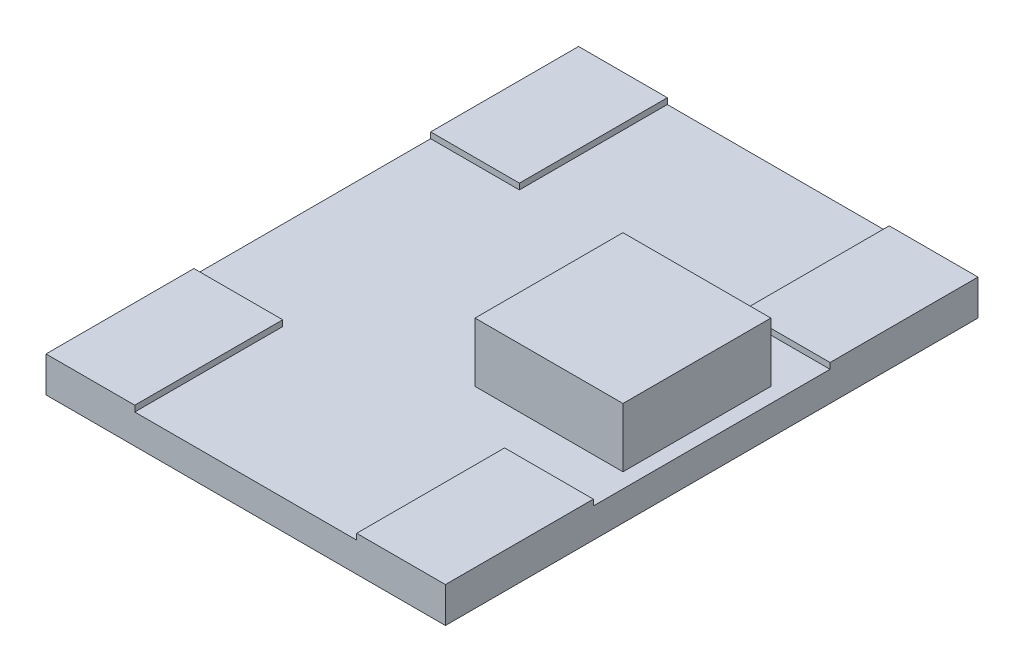
ISO-10303-21;
HEADER;
FILE_DESCRIPTION(('STEP AP214'),'2;1');
FILE_NAME('part.step','',(''),(''),'','','');
FILE_SCHEMA(('AUTOMOTIVE_DESIGN { 1 0 10303 214 1 1 1 1 }'));
ENDSEC;
DATA;
#1=APPLICATION_CONTEXT('core data for automotive mechanical design processes');
#2=APPLICATION_PROTOCOL_DEFINITION('international standard','automotive_design',2000,#1);
#3=PRODUCT_CONTEXT('',#1,'mechanical');
#4=PRODUCT('Part','Part','',(#3));
#5=PRODUCT_RELATED_PRODUCT_CATEGORY('part','',(#4));
#6=PRODUCT_DEFINITION_FORMATION('','',#4);
#7=PRODUCT_DEFINITION_CONTEXT('part definition',#1,'design');
#8=PRODUCT_DEFINITION('design','',#6,#7);
#9=PRODUCT_DEFINITION_SHAPE('','',#8);
#10=(LENGTH_UNIT() NAMED_UNIT(*) SI_UNIT(.MILLI.,.METRE.));
#11=(NAMED_UNIT(*) PLANE_ANGLE_UNIT() SI_UNIT($,.RADIAN.));
#12=(NAMED_UNIT(*) SI_UNIT($,.STERADIAN.) SOLID_ANGLE_UNIT());
#13=UNCERTAINTY_MEASURE_WITH_UNIT(LENGTH_MEASURE(1.E-05),#10,'distance_accuracy_value','');
#14=(GEOMETRIC_REPRESENTATION_CONTEXT(3) GLOBAL_UNCERTAINTY_ASSIGNED_CONTEXT((#13)) GLOBAL_UNIT_ASSIGNED_CONTEXT((#10,
#11,#12)) REPRESENTATION_CONTEXT('',''));
#15=CARTESIAN_POINT('',(0.,0.,0.));
#16=DIRECTION('',(0.,0.,1.));
#17=DIRECTION('',(1.,0.,0.));
#18=AXIS2_PLACEMENT_3D('',#15,#16,#17);
#19=CARTESIAN_POINT('',(0.,1.,0.));
#20=DIRECTION('',(0.,-1.,0.));
#21=DIRECTION('',(0.,0.,-1.));
#22=AXIS2_PLACEMENT_3D('',#19,#20,#21);
#23=PLANE('',#22);
#24=DIRECTION('',(0.,0.,1.));
#25=VECTOR('',#24,1.);
#26=CARTESIAN_POINT('',(3.75,1.,-9.));
#27=LINE('',#26,#25);
#28=CARTESIAN_POINT('',(3.75,1.,-9.));
#29=VERTEX_POINT('',#28);
#30=CARTESIAN_POINT('',(3.75,1.,-4.));
#31=VERTEX_POINT('',#30);
#32=EDGE_CURVE('E195',#29,#31,#27,.T.);
#33=ORIENTED_EDGE('',*,*,#32,.F.);
#34=DIRECTION('',(-1.,0.,0.));
#35=VECTOR('',#34,1.);
#36=CARTESIAN_POINT('',(-6.75,1.,-9.));
#37=LINE('',#36,#35);
#38=CARTESIAN_POINT('',(-3.75,1.,-9.));
#39=VERTEX_POINT('',#38);
#40=EDGE_CURVE('E303',#29,#39,#37,.T.);
#41=ORIENTED_EDGE('',*,*,#40,.T.);
#42=DIRECTION('',(0.,0.,-1.));
#43=VECTOR('',#42,1.);
#44=CARTESIAN_POINT('',(-3.75,1.,-9.));
#45=LINE('',#44,#43);
#46=CARTESIAN_POINT('',(-3.75,1.,-4.));
#47=VERTEX_POINT('',#46);
#48=EDGE_CURVE('E230',#47,#39,#45,.T.);
#49=ORIENTED_EDGE('',*,*,#48,.F.);
#50=DIRECTION('',(1.,0.,0.));
#51=VECTOR('',#50,1.);
#52=CARTESIAN_POINT('',(-6.75,1.,-4.));
#53=LINE('',#52,#51);
#54=CARTESIAN_POINT('',(-6.75,1.,-4.));
#55=VERTEX_POINT('',#54);
#56=EDGE_CURVE('E225',#55,#47,#53,.T.);
#57=ORIENTED_EDGE('',*,*,#56,.F.);
#58=DIRECTION('',(0.,0.,1.));
#59=VECTOR('',#58,1.);
#60=CARTESIAN_POINT('',(-6.75,1.,9.));
#61=LINE('',#60,#59);
#62=CARTESIAN_POINT('',(-6.75,1.,4.));
#63=VERTEX_POINT('',#62);
#64=EDGE_CURVE('E306',#55,#63,#61,.T.);
#65=ORIENTED_EDGE('',*,*,#64,.T.);
#66=DIRECTION('',(-1.,0.,0.));
#67=VECTOR('',#66,1.);
#68=CARTESIAN_POINT('',(-6.75,1.,4.));
#69=LINE('',#68,#67);
#70=CARTESIAN_POINT('',(-3.75,1.,4.));
#71=VERTEX_POINT('',#70);
#72=EDGE_CURVE('E280',#71,#63,#69,.T.);
#73=ORIENTED_EDGE('',*,*,#72,.F.);
#74=DIRECTION('',(0.,0.,-1.));
#75=VECTOR('',#74,1.);
#76=CARTESIAN_POINT('',(-3.75,1.,9.));
#77=LINE('',#76,#75);
#78=CARTESIAN_POINT('',(-3.75,1.,9.));
#79=VERTEX_POINT('',#78);
#80=EDGE_CURVE('E275',#79,#71,#77,.T.);
#81=ORIENTED_EDGE('',*,*,#80,.F.);
#82=DIRECTION('',(1.,0.,0.));
#83=VECTOR('',#82,1.);
#84=CARTESIAN_POINT('',(-6.75,1.,9.));
#85=LINE('',#84,#83);
#86=CARTESIAN_POINT('',(3.75,1.,9.));
#87=VERTEX_POINT('',#86);
#88=EDGE_CURVE('E308',#79,#87,#85,.T.);
#89=ORIENTED_EDGE('',*,*,#88,.T.);
#90=DIRECTION('',(0.,0.,1.));
#91=VECTOR('',#90,1.);
#92=CARTESIAN_POINT('',(3.75,1.,9.));
#93=LINE('',#92,#91);
#94=CARTESIAN_POINT('',(3.75,1.,4.));
#95=VERTEX_POINT('',#94);
#96=EDGE_CURVE('E255',#95,#87,#93,.T.);
#97=ORIENTED_EDGE('',*,*,#96,.F.);
#98=DIRECTION('',(-1.,0.,0.));
#99=VECTOR('',#98,1.);
#100=CARTESIAN_POINT('',(6.75,1.,4.));
#101=LINE('',#100,#99);
#102=CARTESIAN_POINT('',(6.75,1.,4.));
#103=VERTEX_POINT('',#102);
#104=EDGE_CURVE('E250',#103,#95,#101,.T.);
#105=ORIENTED_EDGE('',*,*,#104,.F.);
#106=DIRECTION('',(0.,0.,-1.));
#107=VECTOR('',#106,1.);
#108=CARTESIAN_POINT('',(6.75,1.,9.));
#109=LINE('',#108,#107);
#110=CARTESIAN_POINT('',(6.75,1.,-4.));
#111=VERTEX_POINT('',#110);
#112=EDGE_CURVE('E301',#103,#111,#109,.T.);
#113=ORIENTED_EDGE('',*,*,#112,.T.);
#114=DIRECTION('',(1.,0.,0.));
#115=VECTOR('',#114,1.);
#116=CARTESIAN_POINT('',(6.75,1.,-4.));
#117=LINE('',#116,#115);
#118=EDGE_CURVE('E198',#31,#111,#117,.T.);
#119=ORIENTED_EDGE('',*,*,#118,.F.);
#120=EDGE_LOOP('',(#33,#41,#49,#57,#65,#73,#81,#89,#97,#105,#113,#119));
#121=FACE_BOUND('',#120,.T.);
#122=DIRECTION('',(0.,0.,1.));
#123=VECTOR('',#122,1.);
#124=CARTESIAN_POINT('',(1.25,1.,2.5));
#125=LINE('',#124,#123);
#126=CARTESIAN_POINT('',(1.25,1.,-2.5));
#127=VERTEX_POINT('',#126);
#128=CARTESIAN_POINT('',(1.25,1.,2.5));
#129=VERTEX_POINT('',#128);
#130=EDGE_CURVE('E194',#127,#129,#125,.T.);
#131=ORIENTED_EDGE('',*,*,#130,.F.);
#132=DIRECTION('',(-1.,0.,0.));
#133=VECTOR('',#132,1.);
#134=CARTESIAN_POINT('',(6.25,1.,-2.5));
#135=LINE('',#134,#133);
#136=CARTESIAN_POINT('',(6.25,1.,-2.5));
#137=VERTEX_POINT('',#136);
#138=EDGE_CURVE('E191',#137,#127,#135,.T.);
#139=ORIENTED_EDGE('',*,*,#138,.F.);
#140=DIRECTION('',(0.,0.,-1.));
#141=VECTOR('',#140,1.);
#142=CARTESIAN_POINT('',(6.25,1.,2.5));
#143=LINE('',#142,#141);
#144=CARTESIAN_POINT('',(6.25,1.,2.5));
#145=VERTEX_POINT('',#144);
#146=EDGE_CURVE('E57',#145,#137,#143,.T.);
#147=ORIENTED_EDGE('',*,*,#146,.F.);
#148=DIRECTION('',(1.,0.,0.));
#149=VECTOR('',#148,1.);
#150=CARTESIAN_POINT('',(6.25,1.,2.5));
#151=LINE('',#150,#149);
#152=EDGE_CURVE('E52',#129,#145,#151,.T.);
#153=ORIENTED_EDGE('',*,*,#152,.F.);
#154=EDGE_LOOP('',(#131,#139,#147,#153));
#155=FACE_BOUND('',#154,.T.);
#156=ADVANCED_FACE('F37',(#121,#155),#23,.F.);
#157=CARTESIAN_POINT('',(6.75,1.,9.));
#158=DIRECTION('',(-1.,0.,0.));
#159=DIRECTION('',(0.,0.,1.));
#160=AXIS2_PLACEMENT_3D('',#157,#158,#159);
#161=PLANE('',#160);
#162=DIRECTION('',(0.,0.,-1.));
#163=VECTOR('',#162,1.);
#164=CARTESIAN_POINT('',(6.75,0.,9.));
#165=LINE('',#164,#163);
#166=CARTESIAN_POINT('',(6.75,0.,9.));
#167=VERTEX_POINT('',#166);
#168=CARTESIAN_POINT('',(6.75,0.,-9.));
#169=VERTEX_POINT('',#168);
#170=EDGE_CURVE('E300',#167,#169,#165,.T.);
#171=ORIENTED_EDGE('',*,*,#170,.T.);
#172=DIRECTION('',(0.,-1.,0.));
#173=VECTOR('',#172,1.);
#174=CARTESIAN_POINT('',(6.75,1.,-9.));
#175=LINE('',#174,#173);
#176=CARTESIAN_POINT('',(6.75,1.2,-9.));
#177=VERTEX_POINT('',#176);
#178=EDGE_CURVE('E11',#177,#169,#175,.T.);
#179=ORIENTED_EDGE('',*,*,#178,.F.);
#180=DIRECTION('',(0.,0.,-1.));
#181=VECTOR('',#180,1.);
#182=CARTESIAN_POINT('',(6.75,1.2,-9.));
#183=LINE('',#182,#181);
#184=CARTESIAN_POINT('',(6.75,1.2,-4.));
#185=VERTEX_POINT('',#184);
#186=EDGE_CURVE('E211',#185,#177,#183,.T.);
#187=ORIENTED_EDGE('',*,*,#186,.F.);
#188=DIRECTION('',(0.,-1.,0.));
#189=VECTOR('',#188,1.);
#190=CARTESIAN_POINT('',(6.75,1.2,-4.));
#191=LINE('',#190,#189);
#192=EDGE_CURVE('E213',#185,#111,#191,.T.);
#193=ORIENTED_EDGE('',*,*,#192,.T.);
#194=ORIENTED_EDGE('',*,*,#112,.F.);
#195=DIRECTION('',(0.,-1.,0.));
#196=VECTOR('',#195,1.);
#197=CARTESIAN_POINT('',(6.75,1.2,4.));
#198=LINE('',#197,#196);
#199=CARTESIAN_POINT('',(6.75,1.2,4.));
#200=VERTEX_POINT('',#199);
#201=EDGE_CURVE('E272',#200,#103,#198,.T.);
#202=ORIENTED_EDGE('',*,*,#201,.F.);
#203=DIRECTION('',(0.,0.,-1.));
#204=VECTOR('',#203,1.);
#205=CARTESIAN_POINT('',(6.75,1.2,9.));
#206=LINE('',#205,#204);
#207=CARTESIAN_POINT('',(6.75,1.2,9.));
#208=VERTEX_POINT('',#207);
#209=EDGE_CURVE('E251',#208,#200,#206,.T.);
#210=ORIENTED_EDGE('',*,*,#209,.F.);
#211=DIRECTION('',(0.,-1.,0.));
#212=VECTOR('',#211,1.);
#213=CARTESIAN_POINT('',(6.75,1.,9.));
#214=LINE('',#213,#212);
#215=EDGE_CURVE('E310',#208,#167,#214,.T.);
#216=ORIENTED_EDGE('',*,*,#215,.T.);
#217=EDGE_LOOP('',(#171,#179,#187,#193,#194,#202,#210,#216));
#218=FACE_BOUND('',#217,.T.);
#219=ADVANCED_FACE('F39',(#218),#161,.F.);
#220=CARTESIAN_POINT('',(-6.75,1.,-9.));
#221=DIRECTION('',(0.,0.,1.));
#222=DIRECTION('',(1.,0.,0.));
#223=AXIS2_PLACEMENT_3D('',#220,#221,#222);
#224=PLANE('',#223);
#225=DIRECTION('',(-1.,0.,0.));
#226=VECTOR('',#225,1.);
#227=CARTESIAN_POINT('',(-6.75,0.,-9.));
#228=LINE('',#227,#226);
#229=CARTESIAN_POINT('',(-6.75,0.,-9.));
#230=VERTEX_POINT('',#229);
#231=EDGE_CURVE('E313',#169,#230,#228,.T.);
#232=ORIENTED_EDGE('',*,*,#231,.T.);
#233=DIRECTION('',(0.,-1.,0.));
#234=VECTOR('',#233,1.);
#235=CARTESIAN_POINT('',(-6.75,1.,-9.));
#236=LINE('',#235,#234);
#237=CARTESIAN_POINT('',(-6.75,1.2,-9.));
#238=VERTEX_POINT('',#237);
#239=EDGE_CURVE('E45',#238,#230,#236,.T.);
#240=ORIENTED_EDGE('',*,*,#239,.F.);
#241=DIRECTION('',(-1.,0.,0.));
#242=VECTOR('',#241,1.);
#243=CARTESIAN_POINT('',(-6.75,1.2,-9.));
#244=LINE('',#243,#242);
#245=CARTESIAN_POINT('',(-3.75,1.2,-9.));
#246=VERTEX_POINT('',#245);
#247=EDGE_CURVE('E234',#246,#238,#244,.T.);
#248=ORIENTED_EDGE('',*,*,#247,.F.);
#249=DIRECTION('',(0.,-1.,0.));
#250=VECTOR('',#249,1.);
#251=CARTESIAN_POINT('',(-3.75,1.2,-9.));
#252=LINE('',#251,#250);
#253=EDGE_CURVE('E237',#246,#39,#252,.T.);
#254=ORIENTED_EDGE('',*,*,#253,.T.);
#255=ORIENTED_EDGE('',*,*,#40,.F.);
#256=DIRECTION('',(0.,-1.,0.));
#257=VECTOR('',#256,1.);
#258=CARTESIAN_POINT('',(3.75,1.2,-9.));
#259=LINE('',#258,#257);
#260=CARTESIAN_POINT('',(3.75,1.2,-9.));
#261=VERTEX_POINT('',#260);
#262=EDGE_CURVE('E222',#261,#29,#259,.T.);
#263=ORIENTED_EDGE('',*,*,#262,.F.);
#264=DIRECTION('',(-1.,0.,0.));
#265=VECTOR('',#264,1.);
#266=CARTESIAN_POINT('',(6.75,1.2,-9.));
#267=LINE('',#266,#265);
#268=EDGE_CURVE('E204',#177,#261,#267,.T.);
#269=ORIENTED_EDGE('',*,*,#268,.F.);
#270=ORIENTED_EDGE('',*,*,#178,.T.);
#271=EDGE_LOOP('',(#232,#240,#248,#254,#255,#263,#269,#270));
#272=FACE_BOUND('',#271,.T.);
#273=ADVANCED_FACE('F371',(#272),#224,.F.);
#274=CARTESIAN_POINT('',(-6.75,1.,9.));
#275=DIRECTION('',(1.,0.,0.));
#276=DIRECTION('',(0.,0.,-1.));
#277=AXIS2_PLACEMENT_3D('',#274,#275,#276);
#278=PLANE('',#277);
#279=DIRECTION('',(0.,0.,1.));
#280=VECTOR('',#279,1.);
#281=CARTESIAN_POINT('',(-6.75,0.,9.));
#282=LINE('',#281,#280);
#283=CARTESIAN_POINT('',(-6.75,0.,9.));
#284=VERTEX_POINT('',#283);
#285=EDGE_CURVE('E315',#230,#284,#282,.T.);
#286=ORIENTED_EDGE('',*,*,#285,.T.);
#287=DIRECTION('',(0.,-1.,0.));
#288=VECTOR('',#287,1.);
#289=CARTESIAN_POINT('',(-6.75,1.,9.));
#290=LINE('',#289,#288);
#291=CARTESIAN_POINT('',(-6.75,1.2,9.));
#292=VERTEX_POINT('',#291);
#293=EDGE_CURVE('E320',#292,#284,#290,.T.);
#294=ORIENTED_EDGE('',*,*,#293,.F.);
#295=DIRECTION('',(0.,0.,1.));
#296=VECTOR('',#295,1.);
#297=CARTESIAN_POINT('',(-6.75,1.2,9.));
#298=LINE('',#297,#296);
#299=CARTESIAN_POINT('',(-6.75,1.2,4.));
#300=VERTEX_POINT('',#299);
#301=EDGE_CURVE('E284',#300,#292,#298,.T.);
#302=ORIENTED_EDGE('',*,*,#301,.F.);
#303=DIRECTION('',(0.,-1.,0.));
#304=VECTOR('',#303,1.);
#305=CARTESIAN_POINT('',(-6.75,1.2,4.));
#306=LINE('',#305,#304);
#307=EDGE_CURVE('E287',#300,#63,#306,.T.);
#308=ORIENTED_EDGE('',*,*,#307,.T.);
#309=ORIENTED_EDGE('',*,*,#64,.F.);
#310=DIRECTION('',(0.,-1.,0.));
#311=VECTOR('',#310,1.);
#312=CARTESIAN_POINT('',(-6.75,1.2,-4.));
#313=LINE('',#312,#311);
#314=CARTESIAN_POINT('',(-6.75,1.2,-4.));
#315=VERTEX_POINT('',#314);
#316=EDGE_CURVE('E247',#315,#55,#313,.T.);
#317=ORIENTED_EDGE('',*,*,#316,.F.);
#318=DIRECTION('',(0.,0.,1.));
#319=VECTOR('',#318,1.);
#320=CARTESIAN_POINT('',(-6.75,1.2,-9.));
#321=LINE('',#320,#319);
#322=EDGE_CURVE('E226',#238,#315,#321,.T.);
#323=ORIENTED_EDGE('',*,*,#322,.F.);
#324=ORIENTED_EDGE('',*,*,#239,.T.);
#325=EDGE_LOOP('',(#286,#294,#302,#308,#309,#317,#323,#324));
#326=FACE_BOUND('',#325,.T.);
#327=ADVANCED_FACE('F326',(#326),#278,.F.);
#328=CARTESIAN_POINT('',(-6.75,1.,9.));
#329=DIRECTION('',(0.,0.,-1.));
#330=DIRECTION('',(-1.,0.,0.));
#331=AXIS2_PLACEMENT_3D('',#328,#329,#330);
#332=PLANE('',#331);
#333=DIRECTION('',(1.,0.,0.));
#334=VECTOR('',#333,1.);
#335=CARTESIAN_POINT('',(-6.75,0.,9.));
#336=LINE('',#335,#334);
#337=EDGE_CURVE('E304',#284,#167,#336,.T.);
#338=ORIENTED_EDGE('',*,*,#337,.T.);
#339=ORIENTED_EDGE('',*,*,#215,.F.);
#340=DIRECTION('',(1.,0.,0.));
#341=VECTOR('',#340,1.);
#342=CARTESIAN_POINT('',(6.75,1.2,9.));
#343=LINE('',#342,#341);
#344=CARTESIAN_POINT('',(3.75,1.2,9.));
#345=VERTEX_POINT('',#344);
#346=EDGE_CURVE('E259',#345,#208,#343,.T.);
#347=ORIENTED_EDGE('',*,*,#346,.F.);
#348=DIRECTION('',(0.,-1.,0.));
#349=VECTOR('',#348,1.);
#350=CARTESIAN_POINT('',(3.75,1.2,9.));
#351=LINE('',#350,#349);
#352=EDGE_CURVE('E262',#345,#87,#351,.T.);
#353=ORIENTED_EDGE('',*,*,#352,.T.);
#354=ORIENTED_EDGE('',*,*,#88,.F.);
#355=DIRECTION('',(0.,-1.,0.));
#356=VECTOR('',#355,1.);
#357=CARTESIAN_POINT('',(-3.75,1.2,9.));
#358=LINE('',#357,#356);
#359=CARTESIAN_POINT('',(-3.75,1.2,9.));
#360=VERTEX_POINT('',#359);
#361=EDGE_CURVE('E297',#360,#79,#358,.T.);
#362=ORIENTED_EDGE('',*,*,#361,.F.);
#363=DIRECTION('',(1.,0.,0.));
#364=VECTOR('',#363,1.);
#365=CARTESIAN_POINT('',(-6.75,1.2,9.));
#366=LINE('',#365,#364);
#367=EDGE_CURVE('E276',#292,#360,#366,.T.);
#368=ORIENTED_EDGE('',*,*,#367,.F.);
#369=ORIENTED_EDGE('',*,*,#293,.T.);
#370=EDGE_LOOP('',(#338,#339,#347,#353,#354,#362,#368,#369));
#371=FACE_BOUND('',#370,.T.);
#372=ADVANCED_FACE('F335',(#371),#332,.F.);
#373=CARTESIAN_POINT('',(0.,0.,0.));
#374=DIRECTION('',(0.,-1.,0.));
#375=DIRECTION('',(0.,0.,-1.));
#376=AXIS2_PLACEMENT_3D('',#373,#374,#375);
#377=PLANE('',#376);
#378=ORIENTED_EDGE('',*,*,#170,.F.);
#379=ORIENTED_EDGE('',*,*,#337,.F.);
#380=ORIENTED_EDGE('',*,*,#285,.F.);
#381=ORIENTED_EDGE('',*,*,#231,.F.);
#382=EDGE_LOOP('',(#378,#379,#380,#381));
#383=FACE_BOUND('',#382,.T.);
#384=ADVANCED_FACE('F333',(#383),#377,.T.);
#385=CARTESIAN_POINT('',(-3.75,1.2,9.));
#386=DIRECTION('',(-1.,0.,0.));
#387=DIRECTION('',(0.,0.,1.));
#388=AXIS2_PLACEMENT_3D('',#385,#386,#387);
#389=PLANE('',#388);
#390=ORIENTED_EDGE('',*,*,#80,.T.);
#391=DIRECTION('',(0.,-1.,0.));
#392=VECTOR('',#391,1.);
#393=CARTESIAN_POINT('',(-3.75,1.2,4.));
#394=LINE('',#393,#392);
#395=CARTESIAN_POINT('',(-3.75,1.2,4.));
#396=VERTEX_POINT('',#395);
#397=EDGE_CURVE('E294',#396,#71,#394,.T.);
#398=ORIENTED_EDGE('',*,*,#397,.F.);
#399=DIRECTION('',(0.,0.,-1.));
#400=VECTOR('',#399,1.);
#401=CARTESIAN_POINT('',(-3.75,1.2,9.));
#402=LINE('',#401,#400);
#403=EDGE_CURVE('E279',#360,#396,#402,.T.);
#404=ORIENTED_EDGE('',*,*,#403,.F.);
#405=ORIENTED_EDGE('',*,*,#361,.T.);
#406=EDGE_LOOP('',(#390,#398,#404,#405));
#407=FACE_BOUND('',#406,.T.);
#408=ADVANCED_FACE('F374',(#407),#389,.F.);
#409=CARTESIAN_POINT('',(-6.75,1.2,4.));
#410=DIRECTION('',(0.,0.,1.));
#411=DIRECTION('',(1.,0.,0.));
#412=AXIS2_PLACEMENT_3D('',#409,#410,#411);
#413=PLANE('',#412);
#414=ORIENTED_EDGE('',*,*,#72,.T.);
#415=ORIENTED_EDGE('',*,*,#307,.F.);
#416=DIRECTION('',(-1.,0.,0.));
#417=VECTOR('',#416,1.);
#418=CARTESIAN_POINT('',(-6.75,1.2,4.));
#419=LINE('',#418,#417);
#420=EDGE_CURVE('E282',#396,#300,#419,.T.);
#421=ORIENTED_EDGE('',*,*,#420,.F.);
#422=ORIENTED_EDGE('',*,*,#397,.T.);
#423=EDGE_LOOP('',(#414,#415,#421,#422));
#424=FACE_BOUND('',#423,.T.);
#425=ADVANCED_FACE('F363',(#424),#413,.F.);
#426=CARTESIAN_POINT('',(0.,1.2,0.));
#427=DIRECTION('',(0.,1.,0.));
#428=DIRECTION('',(0.,0.,1.));
#429=AXIS2_PLACEMENT_3D('',#426,#427,#428);
#430=PLANE('',#429);
#431=ORIENTED_EDGE('',*,*,#367,.T.);
#432=ORIENTED_EDGE('',*,*,#403,.T.);
#433=ORIENTED_EDGE('',*,*,#420,.T.);
#434=ORIENTED_EDGE('',*,*,#301,.T.);
#435=EDGE_LOOP('',(#431,#432,#433,#434));
#436=FACE_BOUND('',#435,.T.);
#437=ADVANCED_FACE('F356',(#436),#430,.T.);
#438=CARTESIAN_POINT('',(6.75,1.2,4.));
#439=DIRECTION('',(0.,0.,1.));
#440=DIRECTION('',(1.,0.,0.));
#441=AXIS2_PLACEMENT_3D('',#438,#439,#440);
#442=PLANE('',#441);
#443=ORIENTED_EDGE('',*,*,#104,.T.);
#444=DIRECTION('',(0.,-1.,0.));
#445=VECTOR('',#444,1.);
#446=CARTESIAN_POINT('',(3.75,1.2,4.));
#447=LINE('',#446,#445);
#448=CARTESIAN_POINT('',(3.75,1.2,4.));
#449=VERTEX_POINT('',#448);
#450=EDGE_CURVE('E269',#449,#95,#447,.T.);
#451=ORIENTED_EDGE('',*,*,#450,.F.);
#452=DIRECTION('',(-1.,0.,0.));
#453=VECTOR('',#452,1.);
#454=CARTESIAN_POINT('',(6.75,1.2,4.));
#455=LINE('',#454,#453);
#456=EDGE_CURVE('E254',#200,#449,#455,.T.);
#457=ORIENTED_EDGE('',*,*,#456,.F.);
#458=ORIENTED_EDGE('',*,*,#201,.T.);
#459=EDGE_LOOP('',(#443,#451,#457,#458));
#460=FACE_BOUND('',#459,.T.);
#461=ADVANCED_FACE('F354',(#460),#442,.F.);
#462=CARTESIAN_POINT('',(3.75,1.2,9.));
#463=DIRECTION('',(1.,0.,0.));
#464=DIRECTION('',(0.,0.,-1.));
#465=AXIS2_PLACEMENT_3D('',#462,#463,#464);
#466=PLANE('',#465);
#467=ORIENTED_EDGE('',*,*,#96,.T.);
#468=ORIENTED_EDGE('',*,*,#352,.F.);
#469=DIRECTION('',(0.,0.,1.));
#470=VECTOR('',#469,1.);
#471=CARTESIAN_POINT('',(3.75,1.2,9.));
#472=LINE('',#471,#470);
#473=EDGE_CURVE('E257',#449,#345,#472,.T.);
#474=ORIENTED_EDGE('',*,*,#473,.F.);
#475=ORIENTED_EDGE('',*,*,#450,.T.);
#476=EDGE_LOOP('',(#467,#468,#474,#475));
#477=FACE_BOUND('',#476,.T.);
#478=ADVANCED_FACE('F350',(#477),#466,.F.);
#479=CARTESIAN_POINT('',(0.,1.2,0.));
#480=DIRECTION('',(0.,1.,0.));
#481=DIRECTION('',(0.,0.,1.));
#482=AXIS2_PLACEMENT_3D('',#479,#480,#481);
#483=PLANE('',#482);
#484=ORIENTED_EDGE('',*,*,#209,.T.);
#485=ORIENTED_EDGE('',*,*,#456,.T.);
#486=ORIENTED_EDGE('',*,*,#473,.T.);
#487=ORIENTED_EDGE('',*,*,#346,.T.);
#488=EDGE_LOOP('',(#484,#485,#486,#487));
#489=FACE_BOUND('',#488,.T.);
#490=ADVANCED_FACE('F343',(#489),#483,.T.);
#491=CARTESIAN_POINT('',(-6.75,1.2,-4.));
#492=DIRECTION('',(0.,0.,-1.));
#493=DIRECTION('',(-1.,0.,0.));
#494=AXIS2_PLACEMENT_3D('',#491,#492,#493);
#495=PLANE('',#494);
#496=ORIENTED_EDGE('',*,*,#56,.T.);
#497=DIRECTION('',(0.,-1.,0.));
#498=VECTOR('',#497,1.);
#499=CARTESIAN_POINT('',(-3.75,1.2,-4.));
#500=LINE('',#499,#498);
#501=CARTESIAN_POINT('',(-3.75,1.2,-4.));
#502=VERTEX_POINT('',#501);
#503=EDGE_CURVE('E244',#502,#47,#500,.T.);
#504=ORIENTED_EDGE('',*,*,#503,.F.);
#505=DIRECTION('',(1.,0.,0.));
#506=VECTOR('',#505,1.);
#507=CARTESIAN_POINT('',(-6.75,1.2,-4.));
#508=LINE('',#507,#506);
#509=EDGE_CURVE('E229',#315,#502,#508,.T.);
#510=ORIENTED_EDGE('',*,*,#509,.F.);
#511=ORIENTED_EDGE('',*,*,#316,.T.);
#512=EDGE_LOOP('',(#496,#504,#510,#511));
#513=FACE_BOUND('',#512,.T.);
#514=ADVANCED_FACE('F403',(#513),#495,.F.);
#515=CARTESIAN_POINT('',(-3.75,1.2,-9.));
#516=DIRECTION('',(-1.,0.,0.));
#517=DIRECTION('',(0.,0.,1.));
#518=AXIS2_PLACEMENT_3D('',#515,#516,#517);
#519=PLANE('',#518);
#520=ORIENTED_EDGE('',*,*,#48,.T.);
#521=ORIENTED_EDGE('',*,*,#253,.F.);
#522=DIRECTION('',(0.,0.,-1.));
#523=VECTOR('',#522,1.);
#524=CARTESIAN_POINT('',(-3.75,1.2,-9.));
#525=LINE('',#524,#523);
#526=EDGE_CURVE('E232',#502,#246,#525,.T.);
#527=ORIENTED_EDGE('',*,*,#526,.F.);
#528=ORIENTED_EDGE('',*,*,#503,.T.);
#529=EDGE_LOOP('',(#520,#521,#527,#528));
#530=FACE_BOUND('',#529,.T.);
#531=ADVANCED_FACE('F399',(#530),#519,.F.);
#532=CARTESIAN_POINT('',(0.,1.2,0.));
#533=DIRECTION('',(0.,1.,0.));
#534=DIRECTION('',(0.,0.,1.));
#535=AXIS2_PLACEMENT_3D('',#532,#533,#534);
#536=PLANE('',#535);
#537=ORIENTED_EDGE('',*,*,#322,.T.);
#538=ORIENTED_EDGE('',*,*,#509,.T.);
#539=ORIENTED_EDGE('',*,*,#526,.T.);
#540=ORIENTED_EDGE('',*,*,#247,.T.);
#541=EDGE_LOOP('',(#537,#538,#539,#540));
#542=FACE_BOUND('',#541,.T.);
#543=ADVANCED_FACE('F455',(#542),#536,.T.);
#544=CARTESIAN_POINT('',(3.75,1.2,-9.));
#545=DIRECTION('',(1.,0.,0.));
#546=DIRECTION('',(0.,0.,-1.));
#547=AXIS2_PLACEMENT_3D('',#544,#545,#546);
#548=PLANE('',#547);
#549=ORIENTED_EDGE('',*,*,#32,.T.);
#550=DIRECTION('',(0.,-1.,0.));
#551=VECTOR('',#550,1.);
#552=CARTESIAN_POINT('',(3.75,1.2,-4.));
#553=LINE('',#552,#551);
#554=CARTESIAN_POINT('',(3.75,1.2,-4.));
#555=VERTEX_POINT('',#554);
#556=EDGE_CURVE('E219',#555,#31,#553,.T.);
#557=ORIENTED_EDGE('',*,*,#556,.F.);
#558=DIRECTION('',(0.,0.,1.));
#559=VECTOR('',#558,1.);
#560=CARTESIAN_POINT('',(3.75,1.2,-9.));
#561=LINE('',#560,#559);
#562=EDGE_CURVE('E207',#261,#555,#561,.T.);
#563=ORIENTED_EDGE('',*,*,#562,.F.);
#564=ORIENTED_EDGE('',*,*,#262,.T.);
#565=EDGE_LOOP('',(#549,#557,#563,#564));
#566=FACE_BOUND('',#565,.T.);
#567=ADVANCED_FACE('F395',(#566),#548,.F.);
#568=CARTESIAN_POINT('',(6.75,1.2,-4.));
#569=DIRECTION('',(0.,0.,-1.));
#570=DIRECTION('',(-1.,0.,0.));
#571=AXIS2_PLACEMENT_3D('',#568,#569,#570);
#572=PLANE('',#571);
#573=ORIENTED_EDGE('',*,*,#118,.T.);
#574=ORIENTED_EDGE('',*,*,#192,.F.);
#575=DIRECTION('',(1.,0.,0.));
#576=VECTOR('',#575,1.);
#577=CARTESIAN_POINT('',(6.75,1.2,-4.));
#578=LINE('',#577,#576);
#579=EDGE_CURVE('E209',#555,#185,#578,.T.);
#580=ORIENTED_EDGE('',*,*,#579,.F.);
#581=ORIENTED_EDGE('',*,*,#556,.T.);
#582=EDGE_LOOP('',(#573,#574,#580,#581));
#583=FACE_BOUND('',#582,.T.);
#584=ADVANCED_FACE('F393',(#583),#572,.F.);
#585=CARTESIAN_POINT('',(0.,1.2,0.));
#586=DIRECTION('',(0.,1.,0.));
#587=DIRECTION('',(0.,0.,1.));
#588=AXIS2_PLACEMENT_3D('',#585,#586,#587);
#589=PLANE('',#588);
#590=ORIENTED_EDGE('',*,*,#268,.T.);
#591=ORIENTED_EDGE('',*,*,#562,.T.);
#592=ORIENTED_EDGE('',*,*,#579,.T.);
#593=ORIENTED_EDGE('',*,*,#186,.T.);
#594=EDGE_LOOP('',(#590,#591,#592,#593));
#595=FACE_BOUND('',#594,.T.);
#596=ADVANCED_FACE('F388',(#595),#589,.T.);
#597=CARTESIAN_POINT('',(1.25,3.,2.5));
#598=DIRECTION('',(1.,0.,0.));
#599=DIRECTION('',(0.,0.,-1.));
#600=AXIS2_PLACEMENT_3D('',#597,#598,#599);
#601=PLANE('',#600);
#602=ORIENTED_EDGE('',*,*,#130,.T.);
#603=DIRECTION('',(0.,-1.,0.));
#604=VECTOR('',#603,1.);
#605=CARTESIAN_POINT('',(1.25,3.,2.5));
#606=LINE('',#605,#604);
#607=CARTESIAN_POINT('',(1.25,3.,2.5));
#608=VERTEX_POINT('',#607);
#609=EDGE_CURVE('E175',#608,#129,#606,.T.);
#610=ORIENTED_EDGE('',*,*,#609,.F.);
#611=DIRECTION('',(0.,0.,1.));
#612=VECTOR('',#611,1.);
#613=CARTESIAN_POINT('',(1.25,3.,2.5));
#614=LINE('',#613,#612);
#615=CARTESIAN_POINT('',(1.25,3.,-2.5));
#616=VERTEX_POINT('',#615);
#617=EDGE_CURVE('E182',#616,#608,#614,.T.);
#618=ORIENTED_EDGE('',*,*,#617,.F.);
#619=DIRECTION('',(0.,-1.,0.));
#620=VECTOR('',#619,1.);
#621=CARTESIAN_POINT('',(1.25,3.,-2.5));
#622=LINE('',#621,#620);
#623=EDGE_CURVE('E542',#616,#127,#622,.T.);
#624=ORIENTED_EDGE('',*,*,#623,.T.);
#625=EDGE_LOOP('',(#602,#610,#618,#624));
#626=FACE_BOUND('',#625,.T.);
#627=ADVANCED_FACE('F193',(#626),#601,.F.);
#628=CARTESIAN_POINT('',(6.25,3.,2.5));
#629=DIRECTION('',(0.,0.,-1.));
#630=DIRECTION('',(-1.,0.,0.));
#631=AXIS2_PLACEMENT_3D('',#628,#629,#630);
#632=PLANE('',#631);
#633=ORIENTED_EDGE('',*,*,#152,.T.);
#634=DIRECTION('',(0.,-1.,0.));
#635=VECTOR('',#634,1.);
#636=CARTESIAN_POINT('',(6.25,3.,2.5));
#637=LINE('',#636,#635);
#638=CARTESIAN_POINT('',(6.25,3.,2.5));
#639=VERTEX_POINT('',#638);
#640=EDGE_CURVE('E178',#639,#145,#637,.T.);
#641=ORIENTED_EDGE('',*,*,#640,.F.);
#642=DIRECTION('',(1.,0.,0.));
#643=VECTOR('',#642,1.);
#644=CARTESIAN_POINT('',(6.25,3.,2.5));
#645=LINE('',#644,#643);
#646=EDGE_CURVE('E171',#608,#639,#645,.T.);
#647=ORIENTED_EDGE('',*,*,#646,.F.);
#648=ORIENTED_EDGE('',*,*,#609,.T.);
#649=EDGE_LOOP('',(#633,#641,#647,#648));
#650=FACE_BOUND('',#649,.T.);
#651=ADVANCED_FACE('F173',(#650),#632,.F.);
#652=CARTESIAN_POINT('',(6.25,3.,2.5));
#653=DIRECTION('',(-1.,0.,0.));
#654=DIRECTION('',(0.,0.,1.));
#655=AXIS2_PLACEMENT_3D('',#652,#653,#654);
#656=PLANE('',#655);
#657=ORIENTED_EDGE('',*,*,#146,.T.);
#658=DIRECTION('',(0.,-1.,0.));
#659=VECTOR('',#658,1.);
#660=CARTESIAN_POINT('',(6.25,3.,-2.5));
#661=LINE('',#660,#659);
#662=CARTESIAN_POINT('',(6.25,3.,-2.5));
#663=VERTEX_POINT('',#662);
#664=EDGE_CURVE('E200',#663,#137,#661,.T.);
#665=ORIENTED_EDGE('',*,*,#664,.F.);
#666=DIRECTION('',(0.,0.,-1.));
#667=VECTOR('',#666,1.);
#668=CARTESIAN_POINT('',(6.25,3.,2.5));
#669=LINE('',#668,#667);
#670=EDGE_CURVE('E181',#639,#663,#669,.T.);
#671=ORIENTED_EDGE('',*,*,#670,.F.);
#672=ORIENTED_EDGE('',*,*,#640,.T.);
#673=EDGE_LOOP('',(#657,#665,#671,#672));
#674=FACE_BOUND('',#673,.T.);
#675=ADVANCED_FACE('F509',(#674),#656,.F.);
#676=CARTESIAN_POINT('',(6.25,3.,-2.5));
#677=DIRECTION('',(0.,0.,1.));
#678=DIRECTION('',(1.,0.,0.));
#679=AXIS2_PLACEMENT_3D('',#676,#677,#678);
#680=PLANE('',#679);
#681=ORIENTED_EDGE('',*,*,#138,.T.);
#682=ORIENTED_EDGE('',*,*,#623,.F.);
#683=DIRECTION('',(-1.,0.,0.));
#684=VECTOR('',#683,1.);
#685=CARTESIAN_POINT('',(6.25,3.,-2.5));
#686=LINE('',#685,#684);
#687=EDGE_CURVE('E187',#663,#616,#686,.T.);
#688=ORIENTED_EDGE('',*,*,#687,.F.);
#689=ORIENTED_EDGE('',*,*,#664,.T.);
#690=EDGE_LOOP('',(#681,#682,#688,#689));
#691=FACE_BOUND('',#690,.T.);
#692=ADVANCED_FACE('F518',(#691),#680,.F.);
#693=CARTESIAN_POINT('',(0.,3.,0.));
#694=DIRECTION('',(0.,1.,0.));
#695=DIRECTION('',(0.,0.,1.));
#696=AXIS2_PLACEMENT_3D('',#693,#694,#695);
#697=PLANE('',#696);
#698=ORIENTED_EDGE('',*,*,#617,.T.);
#699=ORIENTED_EDGE('',*,*,#646,.T.);
#700=ORIENTED_EDGE('',*,*,#670,.T.);
#701=ORIENTED_EDGE('',*,*,#687,.T.);
#702=EDGE_LOOP('',(#698,#699,#700,#701));
#703=FACE_BOUND('',#702,.T.);
#704=ADVANCED_FACE('F185',(#703),#697,.T.);
#705=CLOSED_SHELL('',(#156,#219,#273,#327,#372,#384,#408,#425,#437,#461,#478,#490,#514,#531,
#543,#567,#584,#596,#627,#651,#675,#692,#704));
#706=MANIFOLD_SOLID_BREP('B2',#705);
#707=ADVANCED_BREP_SHAPE_REPRESENTATION('',(#18,#706),#14);
#708=SHAPE_DEFINITION_REPRESENTATION(#9,#707);
ENDSEC;
END-ISO-10303-21;
